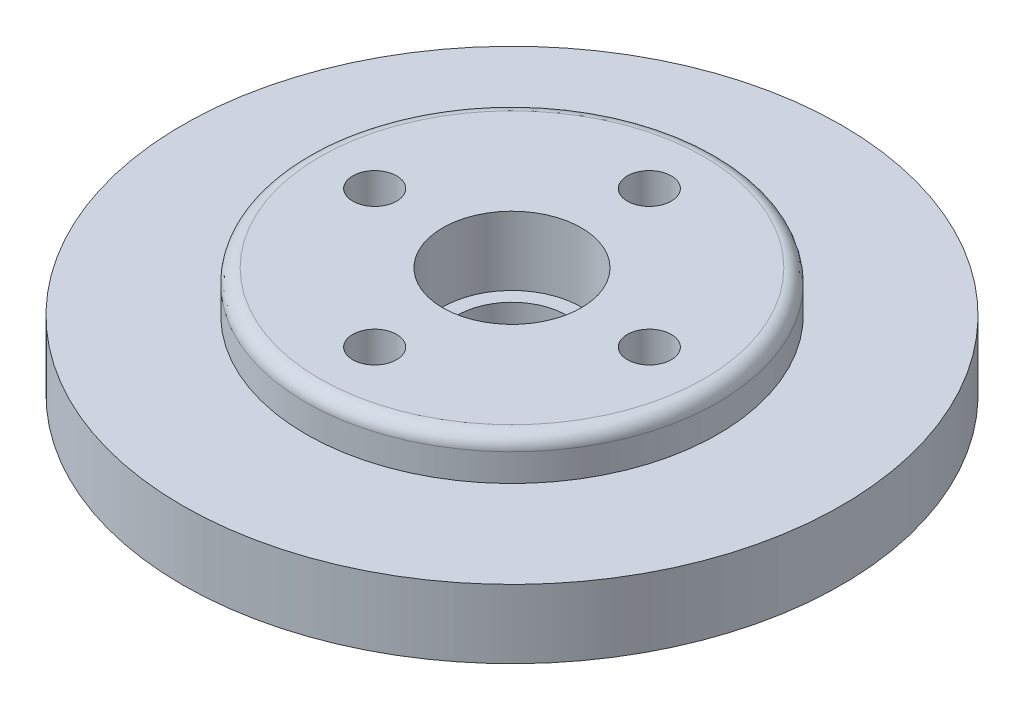
ISO-10303-21;
HEADER;
FILE_DESCRIPTION(('STEP AP214'),'2;1');
FILE_NAME('part.step','',(''),(''),'','','');
FILE_SCHEMA(('AUTOMOTIVE_DESIGN { 1 0 10303 214 1 1 1 1 }'));
ENDSEC;
DATA;
#1=APPLICATION_CONTEXT('core data for automotive mechanical design processes');
#2=APPLICATION_PROTOCOL_DEFINITION('international standard','automotive_design',2000,#1);
#3=PRODUCT_CONTEXT('',#1,'mechanical');
#4=PRODUCT('Part','Part','',(#3));
#5=PRODUCT_RELATED_PRODUCT_CATEGORY('part','',(#4));
#6=PRODUCT_DEFINITION_FORMATION('','',#4);
#7=PRODUCT_DEFINITION_CONTEXT('part definition',#1,'design');
#8=PRODUCT_DEFINITION('design','',#6,#7);
#9=PRODUCT_DEFINITION_SHAPE('','',#8);
#10=(LENGTH_UNIT() NAMED_UNIT(*) SI_UNIT(.MILLI.,.METRE.));
#11=(NAMED_UNIT(*) PLANE_ANGLE_UNIT() SI_UNIT($,.RADIAN.));
#12=(NAMED_UNIT(*) SI_UNIT($,.STERADIAN.) SOLID_ANGLE_UNIT());
#13=UNCERTAINTY_MEASURE_WITH_UNIT(LENGTH_MEASURE(1.E-05),#10,'distance_accuracy_value','');
#14=(GEOMETRIC_REPRESENTATION_CONTEXT(3) GLOBAL_UNCERTAINTY_ASSIGNED_CONTEXT((#13)) GLOBAL_UNIT_ASSIGNED_CONTEXT((#10,
#11,#12)) REPRESENTATION_CONTEXT('',''));
#15=CARTESIAN_POINT('',(0.,0.,0.));
#16=DIRECTION('',(0.,0.,1.));
#17=DIRECTION('',(1.,0.,0.));
#18=AXIS2_PLACEMENT_3D('',#15,#16,#17);
#19=CARTESIAN_POINT('',(-10.,0.,0.));
#20=DIRECTION('',(0.,1.,0.));
#21=DIRECTION('',(0.,0.,1.));
#22=AXIS2_PLACEMENT_3D('',#19,#20,#21);
#23=CYLINDRICAL_SURFACE('',#22,1.6);
#24=CARTESIAN_POINT('',(-10.,8.,0.));
#25=DIRECTION('',(0.,1.,0.));
#26=DIRECTION('',(0.,0.,1.));
#27=AXIS2_PLACEMENT_3D('',#24,#25,#26);
#28=CIRCLE('',#27,1.6);
#29=CARTESIAN_POINT('',(-10.,8.,1.6));
#30=VERTEX_POINT('',#29);
#31=EDGE_CURVE('E407',#30,#30,#28,.T.);
#32=ORIENTED_EDGE('',*,*,#31,.T.);
#33=EDGE_LOOP('',(#32));
#34=FACE_BOUND('',#33,.T.);
#35=CARTESIAN_POINT('',(-10.,3.,0.));
#36=DIRECTION('',(0.,-1.,0.));
#37=DIRECTION('',(0.,0.,-1.));
#38=AXIS2_PLACEMENT_3D('',#35,#36,#37);
#39=CIRCLE('',#38,1.6);
#40=CARTESIAN_POINT('',(-10.,3.,-1.6));
#41=VERTEX_POINT('',#40);
#42=EDGE_CURVE('E40',#41,#41,#39,.F.);
#43=ORIENTED_EDGE('',*,*,#42,.F.);
#44=EDGE_LOOP('',(#43));
#45=FACE_BOUND('',#44,.T.);
#46=ADVANCED_FACE('F36',(#34,#45),#23,.F.);
#47=CARTESIAN_POINT('',(0.,0.,-10.));
#48=DIRECTION('',(0.,1.,0.));
#49=DIRECTION('',(0.,0.,1.));
#50=AXIS2_PLACEMENT_3D('',#47,#48,#49);
#51=CYLINDRICAL_SURFACE('',#50,1.6);
#52=CARTESIAN_POINT('',(0.,8.,-10.));
#53=DIRECTION('',(0.,1.,0.));
#54=DIRECTION('',(0.,0.,1.));
#55=AXIS2_PLACEMENT_3D('',#52,#53,#54);
#56=CIRCLE('',#55,1.6);
#57=CARTESIAN_POINT('',(0.,8.,-8.4));
#58=VERTEX_POINT('',#57);
#59=EDGE_CURVE('E404',#58,#58,#56,.T.);
#60=ORIENTED_EDGE('',*,*,#59,.T.);
#61=EDGE_LOOP('',(#60));
#62=FACE_BOUND('',#61,.T.);
#63=CARTESIAN_POINT('',(0.,3.,-10.));
#64=DIRECTION('',(0.,-1.,0.));
#65=DIRECTION('',(0.,0.,-1.));
#66=AXIS2_PLACEMENT_3D('',#63,#64,#65);
#67=CIRCLE('',#66,1.6);
#68=CARTESIAN_POINT('',(0.,3.,-11.6));
#69=VERTEX_POINT('',#68);
#70=EDGE_CURVE('E436',#69,#69,#67,.F.);
#71=ORIENTED_EDGE('',*,*,#70,.F.);
#72=EDGE_LOOP('',(#71));
#73=FACE_BOUND('',#72,.T.);
#74=ADVANCED_FACE('F446',(#62,#73),#51,.F.);
#75=CARTESIAN_POINT('',(10.,0.,0.));
#76=DIRECTION('',(0.,1.,0.));
#77=DIRECTION('',(0.,0.,1.));
#78=AXIS2_PLACEMENT_3D('',#75,#76,#77);
#79=CYLINDRICAL_SURFACE('',#78,1.6);
#80=CARTESIAN_POINT('',(10.,8.,0.));
#81=DIRECTION('',(0.,1.,0.));
#82=DIRECTION('',(0.,0.,1.));
#83=AXIS2_PLACEMENT_3D('',#80,#81,#82);
#84=CIRCLE('',#83,1.6);
#85=CARTESIAN_POINT('',(10.,8.,1.6));
#86=VERTEX_POINT('',#85);
#87=EDGE_CURVE('E401',#86,#86,#84,.T.);
#88=ORIENTED_EDGE('',*,*,#87,.T.);
#89=EDGE_LOOP('',(#88));
#90=FACE_BOUND('',#89,.T.);
#91=CARTESIAN_POINT('',(10.,3.,0.));
#92=DIRECTION('',(0.,-1.,0.));
#93=DIRECTION('',(0.,0.,-1.));
#94=AXIS2_PLACEMENT_3D('',#91,#92,#93);
#95=CIRCLE('',#94,1.6);
#96=CARTESIAN_POINT('',(10.,3.,-1.6));
#97=VERTEX_POINT('',#96);
#98=EDGE_CURVE('E434',#97,#97,#95,.F.);
#99=ORIENTED_EDGE('',*,*,#98,.F.);
#100=EDGE_LOOP('',(#99));
#101=FACE_BOUND('',#100,.T.);
#102=ADVANCED_FACE('F452',(#90,#101),#79,.F.);
#103=CARTESIAN_POINT('',(0.,0.,10.));
#104=DIRECTION('',(0.,1.,0.));
#105=DIRECTION('',(0.,0.,1.));
#106=AXIS2_PLACEMENT_3D('',#103,#104,#105);
#107=CYLINDRICAL_SURFACE('',#106,1.6);
#108=CARTESIAN_POINT('',(0.,8.,10.));
#109=DIRECTION('',(0.,1.,0.));
#110=DIRECTION('',(0.,0.,1.));
#111=AXIS2_PLACEMENT_3D('',#108,#109,#110);
#112=CIRCLE('',#111,1.6);
#113=CARTESIAN_POINT('',(0.,8.,11.6));
#114=VERTEX_POINT('',#113);
#115=EDGE_CURVE('E397',#114,#114,#112,.T.);
#116=ORIENTED_EDGE('',*,*,#115,.T.);
#117=EDGE_LOOP('',(#116));
#118=FACE_BOUND('',#117,.T.);
#119=CARTESIAN_POINT('',(0.,3.,10.));
#120=DIRECTION('',(0.,-1.,0.));
#121=DIRECTION('',(0.,0.,-1.));
#122=AXIS2_PLACEMENT_3D('',#119,#120,#121);
#123=CIRCLE('',#122,1.6);
#124=CARTESIAN_POINT('',(0.,3.,8.4));
#125=VERTEX_POINT('',#124);
#126=EDGE_CURVE('E248',#125,#125,#123,.F.);
#127=ORIENTED_EDGE('',*,*,#126,.F.);
#128=EDGE_LOOP('',(#127));
#129=FACE_BOUND('',#128,.T.);
#130=ADVANCED_FACE('F813',(#118,#129),#107,.F.);
#131=CARTESIAN_POINT('',(0.,7.,0.));
#132=DIRECTION('',(0.,1.,0.));
#133=DIRECTION('',(0.,0.,1.));
#134=AXIS2_PLACEMENT_3D('',#131,#132,#133);
#135=TOROIDAL_SURFACE('',#134,14.,1.);
#136=CARTESIAN_POINT('',(0.,8.,0.));
#137=DIRECTION('',(0.,1.,0.));
#138=DIRECTION('',(0.,0.,1.));
#139=AXIS2_PLACEMENT_3D('',#136,#137,#138);
#140=CIRCLE('',#139,14.);
#141=CARTESIAN_POINT('',(0.,8.,14.));
#142=VERTEX_POINT('',#141);
#143=EDGE_CURVE('E45',#142,#142,#140,.T.);
#144=ORIENTED_EDGE('',*,*,#143,.F.);
#145=EDGE_LOOP('',(#144));
#146=FACE_BOUND('',#145,.T.);
#147=CARTESIAN_POINT('',(0.,7.,0.));
#148=DIRECTION('',(0.,1.,0.));
#149=DIRECTION('',(0.,0.,1.));
#150=AXIS2_PLACEMENT_3D('',#147,#148,#149);
#151=CIRCLE('',#150,15.);
#152=CARTESIAN_POINT('',(0.,7.,15.));
#153=VERTEX_POINT('',#152);
#154=EDGE_CURVE('E11',#153,#153,#151,.F.);
#155=ORIENTED_EDGE('',*,*,#154,.F.);
#156=EDGE_LOOP('',(#155));
#157=FACE_BOUND('',#156,.T.);
#158=ADVANCED_FACE('F38',(#146,#157),#135,.T.);
#159=CARTESIAN_POINT('',(0.,5.,0.));
#160=DIRECTION('',(0.,-1.,0.));
#161=DIRECTION('',(0.,0.,-1.));
#162=AXIS2_PLACEMENT_3D('',#159,#160,#161);
#163=CYLINDRICAL_SURFACE('',#162,4.);
#164=CARTESIAN_POINT('',(0.,0.,0.));
#165=DIRECTION('',(0.,1.,0.));
#166=DIRECTION('',(0.,0.,1.));
#167=AXIS2_PLACEMENT_3D('',#164,#165,#166);
#168=CIRCLE('',#167,4.);
#169=CARTESIAN_POINT('',(0.,0.,4.));
#170=VERTEX_POINT('',#169);
#171=EDGE_CURVE('E419',#170,#170,#168,.T.);
#172=ORIENTED_EDGE('',*,*,#171,.F.);
#173=EDGE_LOOP('',(#172));
#174=FACE_BOUND('',#173,.T.);
#175=CARTESIAN_POINT('',(0.,3.,0.));
#176=DIRECTION('',(0.,1.,0.));
#177=DIRECTION('',(0.,0.,1.));
#178=AXIS2_PLACEMENT_3D('',#175,#176,#177);
#179=CIRCLE('',#178,4.);
#180=CARTESIAN_POINT('',(0.,3.,4.));
#181=VERTEX_POINT('',#180);
#182=EDGE_CURVE('E413',#181,#181,#179,.T.);
#183=ORIENTED_EDGE('',*,*,#182,.T.);
#184=EDGE_LOOP('',(#183));
#185=FACE_BOUND('',#184,.T.);
#186=ADVANCED_FACE('F474',(#174,#185),#163,.F.);
#187=CARTESIAN_POINT('',(0.,5.,0.));
#188=DIRECTION('',(0.,1.,0.));
#189=DIRECTION('',(0.,0.,1.));
#190=AXIS2_PLACEMENT_3D('',#187,#188,#189);
#191=PLANE('',#190);
#192=CARTESIAN_POINT('',(0.,5.,0.));
#193=DIRECTION('',(0.,1.,0.));
#194=DIRECTION('',(0.,0.,1.));
#195=AXIS2_PLACEMENT_3D('',#192,#193,#194);
#196=CIRCLE('',#195,15.);
#197=CARTESIAN_POINT('',(0.,5.,15.));
#198=VERTEX_POINT('',#197);
#199=EDGE_CURVE('E416',#198,#198,#196,.T.);
#200=ORIENTED_EDGE('',*,*,#199,.F.);
#201=EDGE_LOOP('',(#200));
#202=FACE_BOUND('',#201,.T.);
#203=CARTESIAN_POINT('',(0.,5.,0.));
#204=DIRECTION('',(0.,1.,0.));
#205=DIRECTION('',(0.,0.,1.));
#206=AXIS2_PLACEMENT_3D('',#203,#204,#205);
#207=CIRCLE('',#206,24.);
#208=CARTESIAN_POINT('',(0.,5.,24.));
#209=VERTEX_POINT('',#208);
#210=EDGE_CURVE('E423',#209,#209,#207,.T.);
#211=ORIENTED_EDGE('',*,*,#210,.T.);
#212=EDGE_LOOP('',(#211));
#213=FACE_BOUND('',#212,.T.);
#214=ADVANCED_FACE('F477',(#202,#213),#191,.T.);
#215=CARTESIAN_POINT('',(0.,0.,0.));
#216=DIRECTION('',(0.,1.,0.));
#217=DIRECTION('',(0.,0.,1.));
#218=AXIS2_PLACEMENT_3D('',#215,#216,#217);
#219=PLANE('',#218);
#220=DIRECTION('',(-0.5,0.,0.866025403784438));
#221=VECTOR('',#220,1.);
#222=CARTESIAN_POINT('',(3.1,0.,10.));
#223=LINE('',#222,#221);
#224=CARTESIAN_POINT('',(3.1,0.,10.));
#225=VERTEX_POINT('',#224);
#226=CARTESIAN_POINT('',(1.55,0.,12.6846787517318));
#227=VERTEX_POINT('',#226);
#228=EDGE_CURVE('E235',#225,#227,#223,.T.);
#229=ORIENTED_EDGE('',*,*,#228,.F.);
#230=DIRECTION('',(0.5,0.,0.866025403784439));
#231=VECTOR('',#230,1.);
#232=CARTESIAN_POINT('',(1.55,0.,7.31532124826824));
#233=LINE('',#232,#231);
#234=CARTESIAN_POINT('',(1.55,0.,7.31532124826824));
#235=VERTEX_POINT('',#234);
#236=EDGE_CURVE('E53',#235,#225,#233,.T.);
#237=ORIENTED_EDGE('',*,*,#236,.F.);
#238=DIRECTION('',(1.,0.,0.));
#239=VECTOR('',#238,1.);
#240=CARTESIAN_POINT('',(-1.55,0.,7.31532124826824));
#241=LINE('',#240,#239);
#242=CARTESIAN_POINT('',(-1.55,0.,7.31532124826824));
#243=VERTEX_POINT('',#242);
#244=EDGE_CURVE('E221',#243,#235,#241,.T.);
#245=ORIENTED_EDGE('',*,*,#244,.F.);
#246=DIRECTION('',(0.5,0.,-0.866025403784439));
#247=VECTOR('',#246,1.);
#248=CARTESIAN_POINT('',(-3.1,0.,10.));
#249=LINE('',#248,#247);
#250=CARTESIAN_POINT('',(-3.1,0.,10.));
#251=VERTEX_POINT('',#250);
#252=EDGE_CURVE('E224',#251,#243,#249,.T.);
#253=ORIENTED_EDGE('',*,*,#252,.F.);
#254=DIRECTION('',(-0.5,0.,-0.866025403784438));
#255=VECTOR('',#254,1.);
#256=CARTESIAN_POINT('',(-1.55,0.,12.6846787517318));
#257=LINE('',#256,#255);
#258=CARTESIAN_POINT('',(-1.55,0.,12.6846787517318));
#259=VERTEX_POINT('',#258);
#260=EDGE_CURVE('E241',#259,#251,#257,.T.);
#261=ORIENTED_EDGE('',*,*,#260,.F.);
#262=DIRECTION('',(-1.,0.,0.));
#263=VECTOR('',#262,1.);
#264=CARTESIAN_POINT('',(1.55,0.,12.6846787517318));
#265=LINE('',#264,#263);
#266=EDGE_CURVE('E238',#227,#259,#265,.T.);
#267=ORIENTED_EDGE('',*,*,#266,.F.);
#268=EDGE_LOOP('',(#229,#237,#245,#253,#261,#267));
#269=FACE_BOUND('',#268,.T.);
#270=DIRECTION('',(0.866025403784438,0.,0.5));
#271=VECTOR('',#270,1.);
#272=CARTESIAN_POINT('',(10.0000000000002,0.,-3.09999999999975));
#273=LINE('',#272,#271);
#274=CARTESIAN_POINT('',(10.0000000000002,0.,-3.09999999999975));
#275=VERTEX_POINT('',#274);
#276=CARTESIAN_POINT('',(12.6846787517319,0.,-1.54999999999975));
#277=VERTEX_POINT('',#276);
#278=EDGE_CURVE('E277',#275,#277,#273,.T.);
#279=ORIENTED_EDGE('',*,*,#278,.F.);
#280=DIRECTION('',(0.866025403784439,0.,-0.5));
#281=VECTOR('',#280,1.);
#282=CARTESIAN_POINT('',(7.3153212482684,0.,-1.54999999999975));
#283=LINE('',#282,#281);
#284=CARTESIAN_POINT('',(7.3153212482684,0.,-1.54999999999975));
#285=VERTEX_POINT('',#284);
#286=EDGE_CURVE('E61',#285,#275,#283,.T.);
#287=ORIENTED_EDGE('',*,*,#286,.F.);
#288=DIRECTION('',(0.,0.,-1.));
#289=VECTOR('',#288,1.);
#290=CARTESIAN_POINT('',(7.3153212482684,0.,1.55000000000025));
#291=LINE('',#290,#289);
#292=CARTESIAN_POINT('',(7.3153212482684,0.,1.55000000000025));
#293=VERTEX_POINT('',#292);
#294=EDGE_CURVE('E260',#293,#285,#291,.T.);
#295=ORIENTED_EDGE('',*,*,#294,.F.);
#296=DIRECTION('',(-0.866025403784439,0.,-0.5));
#297=VECTOR('',#296,1.);
#298=CARTESIAN_POINT('',(10.0000000000002,0.,3.10000000000025));
#299=LINE('',#298,#297);
#300=CARTESIAN_POINT('',(10.0000000000002,0.,3.10000000000025));
#301=VERTEX_POINT('',#300);
#302=EDGE_CURVE('E287',#301,#293,#299,.T.);
#303=ORIENTED_EDGE('',*,*,#302,.F.);
#304=DIRECTION('',(-0.866025403784439,0.,0.5));
#305=VECTOR('',#304,1.);
#306=CARTESIAN_POINT('',(12.6846787517319,0.,1.55000000000025));
#307=LINE('',#306,#305);
#308=CARTESIAN_POINT('',(12.6846787517319,0.,1.55000000000025));
#309=VERTEX_POINT('',#308);
#310=EDGE_CURVE('E284',#309,#301,#307,.T.);
#311=ORIENTED_EDGE('',*,*,#310,.F.);
#312=DIRECTION('',(0.,0.,1.));
#313=VECTOR('',#312,1.);
#314=CARTESIAN_POINT('',(12.6846787517319,0.,-1.54999999999975));
#315=LINE('',#314,#313);
#316=EDGE_CURVE('E281',#277,#309,#315,.T.);
#317=ORIENTED_EDGE('',*,*,#316,.F.);
#318=EDGE_LOOP('',(#279,#287,#295,#303,#311,#317));
#319=FACE_BOUND('',#318,.T.);
#320=DIRECTION('',(0.5,0.,-0.866025403784438));
#321=VECTOR('',#320,1.);
#322=CARTESIAN_POINT('',(-3.09999999999959,0.,-9.99999999999992));
#323=LINE('',#322,#321);
#324=CARTESIAN_POINT('',(-3.09999999999959,0.,-9.99999999999992));
#325=VERTEX_POINT('',#324);
#326=CARTESIAN_POINT('',(-1.54999999999959,0.,-12.6846787517317));
#327=VERTEX_POINT('',#326);
#328=EDGE_CURVE('E324',#325,#327,#323,.T.);
#329=ORIENTED_EDGE('',*,*,#328,.F.);
#330=DIRECTION('',(-0.5,0.,-0.866025403784439));
#331=VECTOR('',#330,1.);
#332=CARTESIAN_POINT('',(-1.54999999999959,0.,-7.31532124826816));
#333=LINE('',#332,#331);
#334=CARTESIAN_POINT('',(-1.54999999999959,0.,-7.31532124826816));
#335=VERTEX_POINT('',#334);
#336=EDGE_CURVE('E322',#335,#325,#333,.T.);
#337=ORIENTED_EDGE('',*,*,#336,.F.);
#338=DIRECTION('',(-1.,0.,0.));
#339=VECTOR('',#338,1.);
#340=CARTESIAN_POINT('',(1.55000000000041,0.,-7.31532124826816));
#341=LINE('',#340,#339);
#342=CARTESIAN_POINT('',(1.55000000000041,0.,-7.31532124826816));
#343=VERTEX_POINT('',#342);
#344=EDGE_CURVE('E306',#343,#335,#341,.T.);
#345=ORIENTED_EDGE('',*,*,#344,.F.);
#346=DIRECTION('',(-0.5,0.,0.866025403784438));
#347=VECTOR('',#346,1.);
#348=CARTESIAN_POINT('',(3.10000000000041,0.,-9.99999999999992));
#349=LINE('',#348,#347);
#350=CARTESIAN_POINT('',(3.10000000000041,0.,-9.99999999999992));
#351=VERTEX_POINT('',#350);
#352=EDGE_CURVE('E334',#351,#343,#349,.T.);
#353=ORIENTED_EDGE('',*,*,#352,.F.);
#354=DIRECTION('',(0.5,0.,0.866025403784439));
#355=VECTOR('',#354,1.);
#356=CARTESIAN_POINT('',(1.55000000000041,0.,-12.6846787517317));
#357=LINE('',#356,#355);
#358=CARTESIAN_POINT('',(1.55000000000041,0.,-12.6846787517317));
#359=VERTEX_POINT('',#358);
#360=EDGE_CURVE('E331',#359,#351,#357,.T.);
#361=ORIENTED_EDGE('',*,*,#360,.F.);
#362=DIRECTION('',(1.,0.,0.));
#363=VECTOR('',#362,1.);
#364=CARTESIAN_POINT('',(-1.54999999999959,0.,-12.6846787517317));
#365=LINE('',#364,#363);
#366=EDGE_CURVE('E328',#327,#359,#365,.T.);
#367=ORIENTED_EDGE('',*,*,#366,.F.);
#368=EDGE_LOOP('',(#329,#337,#345,#353,#361,#367));
#369=FACE_BOUND('',#368,.T.);
#370=DIRECTION('',(-0.866025403784438,0.,-0.5));
#371=VECTOR('',#370,1.);
#372=CARTESIAN_POINT('',(-9.99999999999975,0.,3.09999999999983));
#373=LINE('',#372,#371);
#374=CARTESIAN_POINT('',(-9.99999999999975,0.,3.09999999999983));
#375=VERTEX_POINT('',#374);
#376=CARTESIAN_POINT('',(-12.6846787517315,0.,1.54999999999983));
#377=VERTEX_POINT('',#376);
#378=EDGE_CURVE('E372',#375,#377,#373,.T.);
#379=ORIENTED_EDGE('',*,*,#378,.F.);
#380=DIRECTION('',(-0.866025403784439,0.,0.5));
#381=VECTOR('',#380,1.);
#382=CARTESIAN_POINT('',(-7.31532124826799,0.,1.54999999999983));
#383=LINE('',#382,#381);
#384=CARTESIAN_POINT('',(-7.31532124826799,0.,1.54999999999983));
#385=VERTEX_POINT('',#384);
#386=EDGE_CURVE('E370',#385,#375,#383,.T.);
#387=ORIENTED_EDGE('',*,*,#386,.F.);
#388=DIRECTION('',(0.,0.,1.));
#389=VECTOR('',#388,1.);
#390=CARTESIAN_POINT('',(-7.31532124826799,0.,-1.55000000000017));
#391=LINE('',#390,#389);
#392=CARTESIAN_POINT('',(-7.31532124826799,0.,-1.55000000000017));
#393=VERTEX_POINT('',#392);
#394=EDGE_CURVE('E354',#393,#385,#391,.T.);
#395=ORIENTED_EDGE('',*,*,#394,.F.);
#396=DIRECTION('',(0.866025403784438,0.,0.5));
#397=VECTOR('',#396,1.);
#398=CARTESIAN_POINT('',(-9.99999999999975,0.,-3.10000000000017));
#399=LINE('',#398,#397);
#400=CARTESIAN_POINT('',(-9.99999999999975,0.,-3.10000000000017));
#401=VERTEX_POINT('',#400);
#402=EDGE_CURVE('E381',#401,#393,#399,.T.);
#403=ORIENTED_EDGE('',*,*,#402,.F.);
#404=DIRECTION('',(0.866025403784439,0.,-0.5));
#405=VECTOR('',#404,1.);
#406=CARTESIAN_POINT('',(-12.6846787517315,0.,-1.55000000000017));
#407=LINE('',#406,#405);
#408=CARTESIAN_POINT('',(-12.6846787517315,0.,-1.55000000000017));
#409=VERTEX_POINT('',#408);
#410=EDGE_CURVE('E378',#409,#401,#407,.T.);
#411=ORIENTED_EDGE('',*,*,#410,.F.);
#412=DIRECTION('',(0.,0.,-1.));
#413=VECTOR('',#412,1.);
#414=CARTESIAN_POINT('',(-12.6846787517315,0.,1.54999999999983));
#415=LINE('',#414,#413);
#416=EDGE_CURVE('E375',#377,#409,#415,.T.);
#417=ORIENTED_EDGE('',*,*,#416,.F.);
#418=EDGE_LOOP('',(#379,#387,#395,#403,#411,#417));
#419=FACE_BOUND('',#418,.T.);
#420=CARTESIAN_POINT('',(0.,0.,0.));
#421=DIRECTION('',(0.,1.,0.));
#422=DIRECTION('',(0.,0.,1.));
#423=AXIS2_PLACEMENT_3D('',#420,#421,#422);
#424=CIRCLE('',#423,24.);
#425=CARTESIAN_POINT('',(0.,0.,24.));
#426=VERTEX_POINT('',#425);
#427=EDGE_CURVE('E422',#426,#426,#424,.T.);
#428=ORIENTED_EDGE('',*,*,#427,.F.);
#429=EDGE_LOOP('',(#428));
#430=FACE_BOUND('',#429,.T.);
#431=ORIENTED_EDGE('',*,*,#171,.T.);
#432=EDGE_LOOP('',(#431));
#433=FACE_BOUND('',#432,.T.);
#434=ADVANCED_FACE('F481',(#269,#319,#369,#419,#430,#433),#219,.F.);
#435=CARTESIAN_POINT('',(0.,5.,0.));
#436=DIRECTION('',(0.,-1.,0.));
#437=DIRECTION('',(0.,0.,-1.));
#438=AXIS2_PLACEMENT_3D('',#435,#436,#437);
#439=CYLINDRICAL_SURFACE('',#438,24.);
#440=ORIENTED_EDGE('',*,*,#210,.F.);
#441=EDGE_LOOP('',(#440));
#442=FACE_BOUND('',#441,.T.);
#443=ORIENTED_EDGE('',*,*,#427,.T.);
#444=EDGE_LOOP('',(#443));
#445=FACE_BOUND('',#444,.T.);
#446=ADVANCED_FACE('F472',(#442,#445),#439,.T.);
#447=CARTESIAN_POINT('',(0.,8.,0.));
#448=DIRECTION('',(0.,-1.,0.));
#449=DIRECTION('',(0.,0.,-1.));
#450=AXIS2_PLACEMENT_3D('',#447,#448,#449);
#451=CYLINDRICAL_SURFACE('',#450,15.);
#452=ORIENTED_EDGE('',*,*,#154,.T.);
#453=EDGE_LOOP('',(#452));
#454=FACE_BOUND('',#453,.T.);
#455=ORIENTED_EDGE('',*,*,#199,.T.);
#456=EDGE_LOOP('',(#455));
#457=FACE_BOUND('',#456,.T.);
#458=ADVANCED_FACE('F468',(#454,#457),#451,.T.);
#459=CARTESIAN_POINT('',(0.,8.,0.));
#460=DIRECTION('',(0.,1.,0.));
#461=DIRECTION('',(0.,0.,1.));
#462=AXIS2_PLACEMENT_3D('',#459,#460,#461);
#463=PLANE('',#462);
#464=ORIENTED_EDGE('',*,*,#115,.F.);
#465=EDGE_LOOP('',(#464));
#466=FACE_BOUND('',#465,.T.);
#467=ORIENTED_EDGE('',*,*,#87,.F.);
#468=EDGE_LOOP('',(#467));
#469=FACE_BOUND('',#468,.T.);
#470=ORIENTED_EDGE('',*,*,#59,.F.);
#471=EDGE_LOOP('',(#470));
#472=FACE_BOUND('',#471,.T.);
#473=ORIENTED_EDGE('',*,*,#31,.F.);
#474=EDGE_LOOP('',(#473));
#475=FACE_BOUND('',#474,.T.);
#476=ORIENTED_EDGE('',*,*,#143,.T.);
#477=EDGE_LOOP('',(#476));
#478=FACE_BOUND('',#477,.T.);
#479=CARTESIAN_POINT('',(0.,8.,0.));
#480=DIRECTION('',(0.,1.,0.));
#481=DIRECTION('',(0.,0.,1.));
#482=AXIS2_PLACEMENT_3D('',#479,#480,#481);
#483=CIRCLE('',#482,5.05);
#484=CARTESIAN_POINT('',(0.,8.,5.05));
#485=VERTEX_POINT('',#484);
#486=EDGE_CURVE('E400',#485,#485,#483,.T.);
#487=ORIENTED_EDGE('',*,*,#486,.F.);
#488=EDGE_LOOP('',(#487));
#489=FACE_BOUND('',#488,.T.);
#490=ADVANCED_FACE('F464',(#466,#469,#472,#475,#478,#489),#463,.T.);
#491=CARTESIAN_POINT('',(0.,3.,0.));
#492=DIRECTION('',(0.,1.,0.));
#493=DIRECTION('',(0.,0.,1.));
#494=AXIS2_PLACEMENT_3D('',#491,#492,#493);
#495=CYLINDRICAL_SURFACE('',#494,5.05);
#496=CARTESIAN_POINT('',(0.,3.,0.));
#497=DIRECTION('',(0.,1.,0.));
#498=DIRECTION('',(0.,0.,1.));
#499=AXIS2_PLACEMENT_3D('',#496,#497,#498);
#500=CIRCLE('',#499,5.05);
#501=CARTESIAN_POINT('',(0.,3.,5.05));
#502=VERTEX_POINT('',#501);
#503=EDGE_CURVE('E410',#502,#502,#500,.T.);
#504=ORIENTED_EDGE('',*,*,#503,.F.);
#505=EDGE_LOOP('',(#504));
#506=FACE_BOUND('',#505,.T.);
#507=ORIENTED_EDGE('',*,*,#486,.T.);
#508=EDGE_LOOP('',(#507));
#509=FACE_BOUND('',#508,.T.);
#510=ADVANCED_FACE('F460',(#506,#509),#495,.F.);
#511=CARTESIAN_POINT('',(0.,3.,0.));
#512=DIRECTION('',(0.,1.,0.));
#513=DIRECTION('',(0.,0.,1.));
#514=AXIS2_PLACEMENT_3D('',#511,#512,#513);
#515=PLANE('',#514);
#516=ORIENTED_EDGE('',*,*,#182,.F.);
#517=EDGE_LOOP('',(#516));
#518=FACE_BOUND('',#517,.T.);
#519=ORIENTED_EDGE('',*,*,#503,.T.);
#520=EDGE_LOOP('',(#519));
#521=FACE_BOUND('',#520,.T.);
#522=ADVANCED_FACE('F457',(#518,#521),#515,.T.);
#523=CARTESIAN_POINT('',(0.,3.,0.));
#524=DIRECTION('',(0.,-1.,0.));
#525=DIRECTION('',(0.,0.,-1.));
#526=AXIS2_PLACEMENT_3D('',#523,#524,#525);
#527=PLANE('',#526);
#528=DIRECTION('',(0.5,0.,0.866025403784439));
#529=VECTOR('',#528,1.);
#530=CARTESIAN_POINT('',(1.55,3.,7.31532124826824));
#531=LINE('',#530,#529);
#532=CARTESIAN_POINT('',(1.55,3.,7.31532124826824));
#533=VERTEX_POINT('',#532);
#534=CARTESIAN_POINT('',(3.1,3.,10.));
#535=VERTEX_POINT('',#534);
#536=EDGE_CURVE('E201',#533,#535,#531,.T.);
#537=ORIENTED_EDGE('',*,*,#536,.T.);
#538=DIRECTION('',(-0.5,0.,0.866025403784438));
#539=VECTOR('',#538,1.);
#540=CARTESIAN_POINT('',(3.1,3.,10.));
#541=LINE('',#540,#539);
#542=CARTESIAN_POINT('',(1.55,3.,12.6846787517318));
#543=VERTEX_POINT('',#542);
#544=EDGE_CURVE('E210',#535,#543,#541,.T.);
#545=ORIENTED_EDGE('',*,*,#544,.T.);
#546=DIRECTION('',(-1.,0.,0.));
#547=VECTOR('',#546,1.);
#548=CARTESIAN_POINT('',(1.55,3.,12.6846787517318));
#549=LINE('',#548,#547);
#550=CARTESIAN_POINT('',(-1.55,3.,12.6846787517318));
#551=VERTEX_POINT('',#550);
#552=EDGE_CURVE('E215',#543,#551,#549,.T.);
#553=ORIENTED_EDGE('',*,*,#552,.T.);
#554=DIRECTION('',(-0.5,0.,-0.866025403784438));
#555=VECTOR('',#554,1.);
#556=CARTESIAN_POINT('',(-1.55,3.,12.6846787517318));
#557=LINE('',#556,#555);
#558=CARTESIAN_POINT('',(-3.1,3.,10.));
#559=VERTEX_POINT('',#558);
#560=EDGE_CURVE('E228',#551,#559,#557,.T.);
#561=ORIENTED_EDGE('',*,*,#560,.T.);
#562=DIRECTION('',(0.5,0.,-0.866025403784439));
#563=VECTOR('',#562,1.);
#564=CARTESIAN_POINT('',(-3.1,3.,10.));
#565=LINE('',#564,#563);
#566=CARTESIAN_POINT('',(-1.55,3.,7.31532124826824));
#567=VERTEX_POINT('',#566);
#568=EDGE_CURVE('E231',#559,#567,#565,.T.);
#569=ORIENTED_EDGE('',*,*,#568,.T.);
#570=DIRECTION('',(1.,0.,0.));
#571=VECTOR('',#570,1.);
#572=CARTESIAN_POINT('',(-1.55,3.,7.31532124826824));
#573=LINE('',#572,#571);
#574=EDGE_CURVE('E207',#567,#533,#573,.T.);
#575=ORIENTED_EDGE('',*,*,#574,.T.);
#576=EDGE_LOOP('',(#537,#545,#553,#561,#569,#575));
#577=FACE_BOUND('',#576,.T.);
#578=ORIENTED_EDGE('',*,*,#126,.T.);
#579=EDGE_LOOP('',(#578));
#580=FACE_BOUND('',#579,.T.);
#581=ADVANCED_FACE('F217',(#577,#580),#527,.T.);
#582=CARTESIAN_POINT('',(1.55,3.,7.31532124826824));
#583=DIRECTION('',(0.866025403784439,0.,-0.5));
#584=DIRECTION('',(-0.5,0.,-0.866025403784439));
#585=AXIS2_PLACEMENT_3D('',#582,#583,#584);
#586=PLANE('',#585);
#587=ORIENTED_EDGE('',*,*,#236,.T.);
#588=DIRECTION('',(0.,-1.,0.));
#589=VECTOR('',#588,1.);
#590=CARTESIAN_POINT('',(3.1,3.,10.));
#591=LINE('',#590,#589);
#592=EDGE_CURVE('E197',#535,#225,#591,.T.);
#593=ORIENTED_EDGE('',*,*,#592,.F.);
#594=ORIENTED_EDGE('',*,*,#536,.F.);
#595=DIRECTION('',(0.,-1.,0.));
#596=VECTOR('',#595,1.);
#597=CARTESIAN_POINT('',(1.55,3.,7.31532124826824));
#598=LINE('',#597,#596);
#599=EDGE_CURVE('E246',#533,#235,#598,.T.);
#600=ORIENTED_EDGE('',*,*,#599,.T.);
#601=EDGE_LOOP('',(#587,#593,#594,#600));
#602=FACE_BOUND('',#601,.T.);
#603=ADVANCED_FACE('F199',(#602),#586,.F.);
#604=CARTESIAN_POINT('',(-1.55,3.,7.31532124826824));
#605=DIRECTION('',(0.,0.,-1.));
#606=DIRECTION('',(-1.,0.,0.));
#607=AXIS2_PLACEMENT_3D('',#604,#605,#606);
#608=PLANE('',#607);
#609=ORIENTED_EDGE('',*,*,#244,.T.);
#610=ORIENTED_EDGE('',*,*,#599,.F.);
#611=ORIENTED_EDGE('',*,*,#574,.F.);
#612=DIRECTION('',(0.,-1.,0.));
#613=VECTOR('',#612,1.);
#614=CARTESIAN_POINT('',(-1.55,3.,7.31532124826824));
#615=LINE('',#614,#613);
#616=EDGE_CURVE('E249',#567,#243,#615,.T.);
#617=ORIENTED_EDGE('',*,*,#616,.T.);
#618=EDGE_LOOP('',(#609,#610,#611,#617));
#619=FACE_BOUND('',#618,.T.);
#620=ADVANCED_FACE('F536',(#619),#608,.F.);
#621=CARTESIAN_POINT('',(-3.1,3.,10.));
#622=DIRECTION('',(-0.866025403784439,0.,-0.5));
#623=DIRECTION('',(-0.5,0.,0.866025403784439));
#624=AXIS2_PLACEMENT_3D('',#621,#622,#623);
#625=PLANE('',#624);
#626=ORIENTED_EDGE('',*,*,#252,.T.);
#627=ORIENTED_EDGE('',*,*,#616,.F.);
#628=ORIENTED_EDGE('',*,*,#568,.F.);
#629=DIRECTION('',(0.,-1.,0.));
#630=VECTOR('',#629,1.);
#631=CARTESIAN_POINT('',(-3.1,3.,10.));
#632=LINE('',#631,#630);
#633=EDGE_CURVE('E251',#559,#251,#632,.T.);
#634=ORIENTED_EDGE('',*,*,#633,.T.);
#635=EDGE_LOOP('',(#626,#627,#628,#634));
#636=FACE_BOUND('',#635,.T.);
#637=ADVANCED_FACE('F543',(#636),#625,.F.);
#638=CARTESIAN_POINT('',(-1.55,3.,12.6846787517318));
#639=DIRECTION('',(-0.866025403784439,0.,0.5));
#640=DIRECTION('',(0.5,0.,0.866025403784439));
#641=AXIS2_PLACEMENT_3D('',#638,#639,#640);
#642=PLANE('',#641);
#643=ORIENTED_EDGE('',*,*,#260,.T.);
#644=ORIENTED_EDGE('',*,*,#633,.F.);
#645=ORIENTED_EDGE('',*,*,#560,.F.);
#646=DIRECTION('',(0.,-1.,0.));
#647=VECTOR('',#646,1.);
#648=CARTESIAN_POINT('',(-1.55,3.,12.6846787517318));
#649=LINE('',#648,#647);
#650=EDGE_CURVE('E253',#551,#259,#649,.T.);
#651=ORIENTED_EDGE('',*,*,#650,.T.);
#652=EDGE_LOOP('',(#643,#644,#645,#651));
#653=FACE_BOUND('',#652,.T.);
#654=ADVANCED_FACE('F551',(#653),#642,.F.);
#655=CARTESIAN_POINT('',(1.55,3.,12.6846787517318));
#656=DIRECTION('',(0.,0.,1.));
#657=DIRECTION('',(1.,0.,0.));
#658=AXIS2_PLACEMENT_3D('',#655,#656,#657);
#659=PLANE('',#658);
#660=ORIENTED_EDGE('',*,*,#266,.T.);
#661=ORIENTED_EDGE('',*,*,#650,.F.);
#662=ORIENTED_EDGE('',*,*,#552,.F.);
#663=DIRECTION('',(0.,-1.,0.));
#664=VECTOR('',#663,1.);
#665=CARTESIAN_POINT('',(1.55,3.,12.6846787517318));
#666=LINE('',#665,#664);
#667=EDGE_CURVE('E206',#543,#227,#666,.T.);
#668=ORIENTED_EDGE('',*,*,#667,.T.);
#669=EDGE_LOOP('',(#660,#661,#662,#668));
#670=FACE_BOUND('',#669,.T.);
#671=ADVANCED_FACE('F559',(#670),#659,.F.);
#672=CARTESIAN_POINT('',(3.1,3.,10.));
#673=DIRECTION('',(0.866025403784439,0.,0.5));
#674=DIRECTION('',(0.5,0.,-0.866025403784439));
#675=AXIS2_PLACEMENT_3D('',#672,#673,#674);
#676=PLANE('',#675);
#677=ORIENTED_EDGE('',*,*,#228,.T.);
#678=ORIENTED_EDGE('',*,*,#667,.F.);
#679=ORIENTED_EDGE('',*,*,#544,.F.);
#680=ORIENTED_EDGE('',*,*,#592,.T.);
#681=EDGE_LOOP('',(#677,#678,#679,#680));
#682=FACE_BOUND('',#681,.T.);
#683=ADVANCED_FACE('F211',(#682),#676,.F.);
#684=CARTESIAN_POINT('',(0.,3.,0.));
#685=DIRECTION('',(0.,-1.,0.));
#686=DIRECTION('',(0.,0.,-1.));
#687=AXIS2_PLACEMENT_3D('',#684,#685,#686);
#688=PLANE('',#687);
#689=DIRECTION('',(0.866025403784439,0.,-0.5));
#690=VECTOR('',#689,1.);
#691=CARTESIAN_POINT('',(7.3153212482684,3.,-1.54999999999975));
#692=LINE('',#691,#690);
#693=CARTESIAN_POINT('',(7.3153212482684,3.,-1.54999999999975));
#694=VERTEX_POINT('',#693);
#695=CARTESIAN_POINT('',(10.0000000000002,3.,-3.09999999999975));
#696=VERTEX_POINT('',#695);
#697=EDGE_CURVE('E256',#694,#696,#692,.T.);
#698=ORIENTED_EDGE('',*,*,#697,.T.);
#699=DIRECTION('',(0.866025403784438,0.,0.5));
#700=VECTOR('',#699,1.);
#701=CARTESIAN_POINT('',(10.0000000000002,3.,-3.09999999999975));
#702=LINE('',#701,#700);
#703=CARTESIAN_POINT('',(12.6846787517319,3.,-1.54999999999975));
#704=VERTEX_POINT('',#703);
#705=EDGE_CURVE('E259',#696,#704,#702,.T.);
#706=ORIENTED_EDGE('',*,*,#705,.T.);
#707=DIRECTION('',(0.,0.,1.));
#708=VECTOR('',#707,1.);
#709=CARTESIAN_POINT('',(12.6846787517319,3.,-1.54999999999975));
#710=LINE('',#709,#708);
#711=CARTESIAN_POINT('',(12.6846787517319,3.,1.55000000000025));
#712=VERTEX_POINT('',#711);
#713=EDGE_CURVE('E263',#704,#712,#710,.T.);
#714=ORIENTED_EDGE('',*,*,#713,.T.);
#715=DIRECTION('',(-0.866025403784439,0.,0.5));
#716=VECTOR('',#715,1.);
#717=CARTESIAN_POINT('',(12.6846787517319,3.,1.55000000000025));
#718=LINE('',#717,#716);
#719=CARTESIAN_POINT('',(10.0000000000002,3.,3.10000000000025));
#720=VERTEX_POINT('',#719);
#721=EDGE_CURVE('E266',#712,#720,#718,.T.);
#722=ORIENTED_EDGE('',*,*,#721,.T.);
#723=DIRECTION('',(-0.866025403784439,0.,-0.5));
#724=VECTOR('',#723,1.);
#725=CARTESIAN_POINT('',(10.0000000000002,3.,3.10000000000025));
#726=LINE('',#725,#724);
#727=CARTESIAN_POINT('',(7.3153212482684,3.,1.55000000000025));
#728=VERTEX_POINT('',#727);
#729=EDGE_CURVE('E269',#720,#728,#726,.T.);
#730=ORIENTED_EDGE('',*,*,#729,.T.);
#731=DIRECTION('',(0.,0.,-1.));
#732=VECTOR('',#731,1.);
#733=CARTESIAN_POINT('',(7.3153212482684,3.,1.55000000000025));
#734=LINE('',#733,#732);
#735=EDGE_CURVE('E272',#728,#694,#734,.T.);
#736=ORIENTED_EDGE('',*,*,#735,.T.);
#737=EDGE_LOOP('',(#698,#706,#714,#722,#730,#736));
#738=FACE_BOUND('',#737,.T.);
#739=ORIENTED_EDGE('',*,*,#98,.T.);
#740=EDGE_LOOP('',(#739));
#741=FACE_BOUND('',#740,.T.);
#742=ADVANCED_FACE('F574',(#738,#741),#688,.T.);
#743=CARTESIAN_POINT('',(7.3153212482684,3.,-1.54999999999975));
#744=DIRECTION('',(-0.5,0.,-0.866025403784439));
#745=DIRECTION('',(-0.866025403784439,0.,0.5));
#746=AXIS2_PLACEMENT_3D('',#743,#744,#745);
#747=PLANE('',#746);
#748=ORIENTED_EDGE('',*,*,#286,.T.);
#749=DIRECTION('',(0.,-1.,0.));
#750=VECTOR('',#749,1.);
#751=CARTESIAN_POINT('',(10.0000000000002,3.,-3.09999999999975));
#752=LINE('',#751,#750);
#753=EDGE_CURVE('E275',#696,#275,#752,.T.);
#754=ORIENTED_EDGE('',*,*,#753,.F.);
#755=ORIENTED_EDGE('',*,*,#697,.F.);
#756=DIRECTION('',(0.,-1.,0.));
#757=VECTOR('',#756,1.);
#758=CARTESIAN_POINT('',(7.3153212482684,3.,-1.54999999999975));
#759=LINE('',#758,#757);
#760=EDGE_CURVE('E236',#694,#285,#759,.T.);
#761=ORIENTED_EDGE('',*,*,#760,.T.);
#762=EDGE_LOOP('',(#748,#754,#755,#761));
#763=FACE_BOUND('',#762,.T.);
#764=ADVANCED_FACE('F581',(#763),#747,.F.);
#765=CARTESIAN_POINT('',(7.3153212482684,3.,1.55000000000025));
#766=DIRECTION('',(-1.,0.,0.));
#767=DIRECTION('',(0.,0.,1.));
#768=AXIS2_PLACEMENT_3D('',#765,#766,#767);
#769=PLANE('',#768);
#770=ORIENTED_EDGE('',*,*,#294,.T.);
#771=ORIENTED_EDGE('',*,*,#760,.F.);
#772=ORIENTED_EDGE('',*,*,#735,.F.);
#773=DIRECTION('',(0.,-1.,0.));
#774=VECTOR('',#773,1.);
#775=CARTESIAN_POINT('',(7.3153212482684,3.,1.55000000000025));
#776=LINE('',#775,#774);
#777=EDGE_CURVE('E293',#728,#293,#776,.T.);
#778=ORIENTED_EDGE('',*,*,#777,.T.);
#779=EDGE_LOOP('',(#770,#771,#772,#778));
#780=FACE_BOUND('',#779,.T.);
#781=ADVANCED_FACE('F589',(#780),#769,.F.);
#782=CARTESIAN_POINT('',(10.0000000000002,3.,3.10000000000025));
#783=DIRECTION('',(-0.5,0.,0.866025403784438));
#784=DIRECTION('',(0.866025403784439,0.,0.5));
#785=AXIS2_PLACEMENT_3D('',#782,#783,#784);
#786=PLANE('',#785);
#787=ORIENTED_EDGE('',*,*,#302,.T.);
#788=ORIENTED_EDGE('',*,*,#777,.F.);
#789=ORIENTED_EDGE('',*,*,#729,.F.);
#790=DIRECTION('',(0.,-1.,0.));
#791=VECTOR('',#790,1.);
#792=CARTESIAN_POINT('',(10.0000000000002,3.,3.10000000000025));
#793=LINE('',#792,#791);
#794=EDGE_CURVE('E295',#720,#301,#793,.T.);
#795=ORIENTED_EDGE('',*,*,#794,.T.);
#796=EDGE_LOOP('',(#787,#788,#789,#795));
#797=FACE_BOUND('',#796,.T.);
#798=ADVANCED_FACE('F596',(#797),#786,.F.);
#799=CARTESIAN_POINT('',(12.6846787517319,3.,1.55000000000025));
#800=DIRECTION('',(0.5,0.,0.866025403784439));
#801=DIRECTION('',(0.866025403784439,0.,-0.5));
#802=AXIS2_PLACEMENT_3D('',#799,#800,#801);
#803=PLANE('',#802);
#804=ORIENTED_EDGE('',*,*,#310,.T.);
#805=ORIENTED_EDGE('',*,*,#794,.F.);
#806=ORIENTED_EDGE('',*,*,#721,.F.);
#807=DIRECTION('',(0.,-1.,0.));
#808=VECTOR('',#807,1.);
#809=CARTESIAN_POINT('',(12.6846787517319,3.,1.55000000000025));
#810=LINE('',#809,#808);
#811=EDGE_CURVE('E297',#712,#309,#810,.T.);
#812=ORIENTED_EDGE('',*,*,#811,.T.);
#813=EDGE_LOOP('',(#804,#805,#806,#812));
#814=FACE_BOUND('',#813,.T.);
#815=ADVANCED_FACE('F604',(#814),#803,.F.);
#816=CARTESIAN_POINT('',(12.6846787517319,3.,-1.54999999999975));
#817=DIRECTION('',(1.,0.,0.));
#818=DIRECTION('',(0.,0.,-1.));
#819=AXIS2_PLACEMENT_3D('',#816,#817,#818);
#820=PLANE('',#819);
#821=ORIENTED_EDGE('',*,*,#316,.T.);
#822=ORIENTED_EDGE('',*,*,#811,.F.);
#823=ORIENTED_EDGE('',*,*,#713,.F.);
#824=DIRECTION('',(0.,-1.,0.));
#825=VECTOR('',#824,1.);
#826=CARTESIAN_POINT('',(12.6846787517319,3.,-1.54999999999975));
#827=LINE('',#826,#825);
#828=EDGE_CURVE('E299',#704,#277,#827,.T.);
#829=ORIENTED_EDGE('',*,*,#828,.T.);
#830=EDGE_LOOP('',(#821,#822,#823,#829));
#831=FACE_BOUND('',#830,.T.);
#832=ADVANCED_FACE('F612',(#831),#820,.F.);
#833=CARTESIAN_POINT('',(10.0000000000002,3.,-3.09999999999975));
#834=DIRECTION('',(0.5,0.,-0.866025403784438));
#835=DIRECTION('',(-0.866025403784439,0.,-0.5));
#836=AXIS2_PLACEMENT_3D('',#833,#834,#835);
#837=PLANE('',#836);
#838=ORIENTED_EDGE('',*,*,#278,.T.);
#839=ORIENTED_EDGE('',*,*,#828,.F.);
#840=ORIENTED_EDGE('',*,*,#705,.F.);
#841=ORIENTED_EDGE('',*,*,#753,.T.);
#842=EDGE_LOOP('',(#838,#839,#840,#841));
#843=FACE_BOUND('',#842,.T.);
#844=ADVANCED_FACE('F620',(#843),#837,.F.);
#845=CARTESIAN_POINT('',(0.,3.,0.));
#846=DIRECTION('',(0.,-1.,0.));
#847=DIRECTION('',(0.,0.,-1.));
#848=AXIS2_PLACEMENT_3D('',#845,#846,#847);
#849=PLANE('',#848);
#850=DIRECTION('',(-0.5,0.,-0.866025403784439));
#851=VECTOR('',#850,1.);
#852=CARTESIAN_POINT('',(-1.54999999999959,3.,-7.31532124826816));
#853=LINE('',#852,#851);
#854=CARTESIAN_POINT('',(-1.54999999999959,3.,-7.31532124826816));
#855=VERTEX_POINT('',#854);
#856=CARTESIAN_POINT('',(-3.09999999999959,3.,-9.99999999999992));
#857=VERTEX_POINT('',#856);
#858=EDGE_CURVE('E302',#855,#857,#853,.T.);
#859=ORIENTED_EDGE('',*,*,#858,.T.);
#860=DIRECTION('',(0.5,0.,-0.866025403784438));
#861=VECTOR('',#860,1.);
#862=CARTESIAN_POINT('',(-3.09999999999959,3.,-9.99999999999992));
#863=LINE('',#862,#861);
#864=CARTESIAN_POINT('',(-1.54999999999959,3.,-12.6846787517317));
#865=VERTEX_POINT('',#864);
#866=EDGE_CURVE('E305',#857,#865,#863,.T.);
#867=ORIENTED_EDGE('',*,*,#866,.T.);
#868=DIRECTION('',(1.,0.,0.));
#869=VECTOR('',#868,1.);
#870=CARTESIAN_POINT('',(-1.54999999999959,3.,-12.6846787517317));
#871=LINE('',#870,#869);
#872=CARTESIAN_POINT('',(1.55000000000041,3.,-12.6846787517317));
#873=VERTEX_POINT('',#872);
#874=EDGE_CURVE('E309',#865,#873,#871,.T.);
#875=ORIENTED_EDGE('',*,*,#874,.T.);
#876=DIRECTION('',(0.5,0.,0.866025403784439));
#877=VECTOR('',#876,1.);
#878=CARTESIAN_POINT('',(1.55000000000041,3.,-12.6846787517317));
#879=LINE('',#878,#877);
#880=CARTESIAN_POINT('',(3.10000000000041,3.,-9.99999999999992));
#881=VERTEX_POINT('',#880);
#882=EDGE_CURVE('E312',#873,#881,#879,.T.);
#883=ORIENTED_EDGE('',*,*,#882,.T.);
#884=DIRECTION('',(-0.5,0.,0.866025403784438));
#885=VECTOR('',#884,1.);
#886=CARTESIAN_POINT('',(3.10000000000041,3.,-9.99999999999992));
#887=LINE('',#886,#885);
#888=CARTESIAN_POINT('',(1.55000000000041,3.,-7.31532124826816));
#889=VERTEX_POINT('',#888);
#890=EDGE_CURVE('E315',#881,#889,#887,.T.);
#891=ORIENTED_EDGE('',*,*,#890,.T.);
#892=DIRECTION('',(-1.,0.,0.));
#893=VECTOR('',#892,1.);
#894=CARTESIAN_POINT('',(1.55000000000041,3.,-7.31532124826816));
#895=LINE('',#894,#893);
#896=EDGE_CURVE('E318',#889,#855,#895,.T.);
#897=ORIENTED_EDGE('',*,*,#896,.T.);
#898=EDGE_LOOP('',(#859,#867,#875,#883,#891,#897));
#899=FACE_BOUND('',#898,.T.);
#900=ORIENTED_EDGE('',*,*,#70,.T.);
#901=EDGE_LOOP('',(#900));
#902=FACE_BOUND('',#901,.T.);
#903=ADVANCED_FACE('F628',(#899,#902),#849,.T.);
#904=CARTESIAN_POINT('',(-1.54999999999959,3.,-7.31532124826816));
#905=DIRECTION('',(-0.866025403784439,0.,0.499999999999999));
#906=DIRECTION('',(0.5,0.,0.866025403784439));
#907=AXIS2_PLACEMENT_3D('',#904,#905,#906);
#908=PLANE('',#907);
#909=ORIENTED_EDGE('',*,*,#336,.T.);
#910=DIRECTION('',(0.,-1.,0.));
#911=VECTOR('',#910,1.);
#912=CARTESIAN_POINT('',(-3.09999999999959,3.,-9.99999999999992));
#913=LINE('',#912,#911);
#914=EDGE_CURVE('E321',#857,#325,#913,.T.);
#915=ORIENTED_EDGE('',*,*,#914,.F.);
#916=ORIENTED_EDGE('',*,*,#858,.F.);
#917=DIRECTION('',(0.,-1.,0.));
#918=VECTOR('',#917,1.);
#919=CARTESIAN_POINT('',(-1.54999999999959,3.,-7.31532124826816));
#920=LINE('',#919,#918);
#921=EDGE_CURVE('E278',#855,#335,#920,.T.);
#922=ORIENTED_EDGE('',*,*,#921,.T.);
#923=EDGE_LOOP('',(#909,#915,#916,#922));
#924=FACE_BOUND('',#923,.T.);
#925=ADVANCED_FACE('F636',(#924),#908,.F.);
#926=CARTESIAN_POINT('',(1.55000000000041,3.,-7.31532124826816));
#927=DIRECTION('',(0.,0.,1.));
#928=DIRECTION('',(1.,0.,0.));
#929=AXIS2_PLACEMENT_3D('',#926,#927,#928);
#930=PLANE('',#929);
#931=ORIENTED_EDGE('',*,*,#344,.T.);
#932=ORIENTED_EDGE('',*,*,#921,.F.);
#933=ORIENTED_EDGE('',*,*,#896,.F.);
#934=DIRECTION('',(0.,-1.,0.));
#935=VECTOR('',#934,1.);
#936=CARTESIAN_POINT('',(1.55000000000041,3.,-7.31532124826816));
#937=LINE('',#936,#935);
#938=EDGE_CURVE('E340',#889,#343,#937,.T.);
#939=ORIENTED_EDGE('',*,*,#938,.T.);
#940=EDGE_LOOP('',(#931,#932,#933,#939));
#941=FACE_BOUND('',#940,.T.);
#942=ADVANCED_FACE('F644',(#941),#930,.F.);
#943=CARTESIAN_POINT('',(3.10000000000041,3.,-9.99999999999992));
#944=DIRECTION('',(0.866025403784439,0.,0.5));
#945=DIRECTION('',(0.5,0.,-0.866025403784439));
#946=AXIS2_PLACEMENT_3D('',#943,#944,#945);
#947=PLANE('',#946);
#948=ORIENTED_EDGE('',*,*,#352,.T.);
#949=ORIENTED_EDGE('',*,*,#938,.F.);
#950=ORIENTED_EDGE('',*,*,#890,.F.);
#951=DIRECTION('',(0.,-1.,0.));
#952=VECTOR('',#951,1.);
#953=CARTESIAN_POINT('',(3.10000000000041,3.,-9.99999999999992));
#954=LINE('',#953,#952);
#955=EDGE_CURVE('E342',#881,#351,#954,.T.);
#956=ORIENTED_EDGE('',*,*,#955,.T.);
#957=EDGE_LOOP('',(#948,#949,#950,#956));
#958=FACE_BOUND('',#957,.T.);
#959=ADVANCED_FACE('F652',(#958),#947,.F.);
#960=CARTESIAN_POINT('',(1.55000000000041,3.,-12.6846787517317));
#961=DIRECTION('',(0.866025403784439,0.,-0.5));
#962=DIRECTION('',(-0.5,0.,-0.866025403784439));
#963=AXIS2_PLACEMENT_3D('',#960,#961,#962);
#964=PLANE('',#963);
#965=ORIENTED_EDGE('',*,*,#360,.T.);
#966=ORIENTED_EDGE('',*,*,#955,.F.);
#967=ORIENTED_EDGE('',*,*,#882,.F.);
#968=DIRECTION('',(0.,-1.,0.));
#969=VECTOR('',#968,1.);
#970=CARTESIAN_POINT('',(1.55000000000041,3.,-12.6846787517317));
#971=LINE('',#970,#969);
#972=EDGE_CURVE('E344',#873,#359,#971,.T.);
#973=ORIENTED_EDGE('',*,*,#972,.T.);
#974=EDGE_LOOP('',(#965,#966,#967,#973));
#975=FACE_BOUND('',#974,.T.);
#976=ADVANCED_FACE('F660',(#975),#964,.F.);
#977=CARTESIAN_POINT('',(-1.54999999999959,3.,-12.6846787517317));
#978=DIRECTION('',(0.,0.,-1.));
#979=DIRECTION('',(-1.,0.,0.));
#980=AXIS2_PLACEMENT_3D('',#977,#978,#979);
#981=PLANE('',#980);
#982=ORIENTED_EDGE('',*,*,#366,.T.);
#983=ORIENTED_EDGE('',*,*,#972,.F.);
#984=ORIENTED_EDGE('',*,*,#874,.F.);
#985=DIRECTION('',(0.,-1.,0.));
#986=VECTOR('',#985,1.);
#987=CARTESIAN_POINT('',(-1.54999999999959,3.,-12.6846787517317));
#988=LINE('',#987,#986);
#989=EDGE_CURVE('E346',#865,#327,#988,.T.);
#990=ORIENTED_EDGE('',*,*,#989,.T.);
#991=EDGE_LOOP('',(#982,#983,#984,#990));
#992=FACE_BOUND('',#991,.T.);
#993=ADVANCED_FACE('F668',(#992),#981,.F.);
#994=CARTESIAN_POINT('',(-3.09999999999959,3.,-9.99999999999992));
#995=DIRECTION('',(-0.866025403784438,0.,-0.5));
#996=DIRECTION('',(-0.5,0.,0.866025403784439));
#997=AXIS2_PLACEMENT_3D('',#994,#995,#996);
#998=PLANE('',#997);
#999=ORIENTED_EDGE('',*,*,#328,.T.);
#1000=ORIENTED_EDGE('',*,*,#989,.F.);
#1001=ORIENTED_EDGE('',*,*,#866,.F.);
#1002=ORIENTED_EDGE('',*,*,#914,.T.);
#1003=EDGE_LOOP('',(#999,#1000,#1001,#1002));
#1004=FACE_BOUND('',#1003,.T.);
#1005=ADVANCED_FACE('F676',(#1004),#998,.F.);
#1006=CARTESIAN_POINT('',(0.,3.,0.));
#1007=DIRECTION('',(0.,-1.,0.));
#1008=DIRECTION('',(0.,0.,-1.));
#1009=AXIS2_PLACEMENT_3D('',#1006,#1007,#1008);
#1010=PLANE('',#1009);
#1011=DIRECTION('',(-0.866025403784439,0.,0.5));
#1012=VECTOR('',#1011,1.);
#1013=CARTESIAN_POINT('',(-7.31532124826799,3.,1.54999999999983));
#1014=LINE('',#1013,#1012);
#1015=CARTESIAN_POINT('',(-7.31532124826799,3.,1.54999999999983));
#1016=VERTEX_POINT('',#1015);
#1017=CARTESIAN_POINT('',(-9.99999999999975,3.,3.09999999999983));
#1018=VERTEX_POINT('',#1017);
#1019=EDGE_CURVE('E350',#1016,#1018,#1014,.T.);
#1020=ORIENTED_EDGE('',*,*,#1019,.T.);
#1021=DIRECTION('',(-0.866025403784438,0.,-0.5));
#1022=VECTOR('',#1021,1.);
#1023=CARTESIAN_POINT('',(-9.99999999999975,3.,3.09999999999983));
#1024=LINE('',#1023,#1022);
#1025=CARTESIAN_POINT('',(-12.6846787517315,3.,1.54999999999983));
#1026=VERTEX_POINT('',#1025);
#1027=EDGE_CURVE('E353',#1018,#1026,#1024,.T.);
#1028=ORIENTED_EDGE('',*,*,#1027,.T.);
#1029=DIRECTION('',(0.,0.,-1.));
#1030=VECTOR('',#1029,1.);
#1031=CARTESIAN_POINT('',(-12.6846787517315,3.,1.54999999999983));
#1032=LINE('',#1031,#1030);
#1033=CARTESIAN_POINT('',(-12.6846787517315,3.,-1.55000000000017));
#1034=VERTEX_POINT('',#1033);
#1035=EDGE_CURVE('E357',#1026,#1034,#1032,.T.);
#1036=ORIENTED_EDGE('',*,*,#1035,.T.);
#1037=DIRECTION('',(0.866025403784439,0.,-0.5));
#1038=VECTOR('',#1037,1.);
#1039=CARTESIAN_POINT('',(-12.6846787517315,3.,-1.55000000000017));
#1040=LINE('',#1039,#1038);
#1041=CARTESIAN_POINT('',(-9.99999999999975,3.,-3.10000000000017));
#1042=VERTEX_POINT('',#1041);
#1043=EDGE_CURVE('E360',#1034,#1042,#1040,.T.);
#1044=ORIENTED_EDGE('',*,*,#1043,.T.);
#1045=DIRECTION('',(0.866025403784438,0.,0.5));
#1046=VECTOR('',#1045,1.);
#1047=CARTESIAN_POINT('',(-9.99999999999975,3.,-3.10000000000017));
#1048=LINE('',#1047,#1046);
#1049=CARTESIAN_POINT('',(-7.31532124826799,3.,-1.55000000000017));
#1050=VERTEX_POINT('',#1049);
#1051=EDGE_CURVE('E363',#1042,#1050,#1048,.T.);
#1052=ORIENTED_EDGE('',*,*,#1051,.T.);
#1053=DIRECTION('',(0.,0.,1.));
#1054=VECTOR('',#1053,1.);
#1055=CARTESIAN_POINT('',(-7.31532124826799,3.,-1.55000000000017));
#1056=LINE('',#1055,#1054);
#1057=EDGE_CURVE('E366',#1050,#1016,#1056,.T.);
#1058=ORIENTED_EDGE('',*,*,#1057,.T.);
#1059=EDGE_LOOP('',(#1020,#1028,#1036,#1044,#1052,#1058));
#1060=FACE_BOUND('',#1059,.T.);
#1061=ORIENTED_EDGE('',*,*,#42,.T.);
#1062=EDGE_LOOP('',(#1061));
#1063=FACE_BOUND('',#1062,.T.);
#1064=ADVANCED_FACE('F443',(#1060,#1063),#1010,.T.);
#1065=CARTESIAN_POINT('',(-7.31532124826799,3.,1.54999999999983));
#1066=DIRECTION('',(0.5,0.,0.866025403784439));
#1067=DIRECTION('',(0.866025403784439,0.,-0.5));
#1068=AXIS2_PLACEMENT_3D('',#1065,#1066,#1067);
#1069=PLANE('',#1068);
#1070=ORIENTED_EDGE('',*,*,#386,.T.);
#1071=DIRECTION('',(0.,-1.,0.));
#1072=VECTOR('',#1071,1.);
#1073=CARTESIAN_POINT('',(-9.99999999999975,3.,3.09999999999983));
#1074=LINE('',#1073,#1072);
#1075=EDGE_CURVE('E369',#1018,#375,#1074,.T.);
#1076=ORIENTED_EDGE('',*,*,#1075,.F.);
#1077=ORIENTED_EDGE('',*,*,#1019,.F.);
#1078=DIRECTION('',(0.,-1.,0.));
#1079=VECTOR('',#1078,1.);
#1080=CARTESIAN_POINT('',(-7.31532124826799,3.,1.54999999999983));
#1081=LINE('',#1080,#1079);
#1082=EDGE_CURVE('E325',#1016,#385,#1081,.T.);
#1083=ORIENTED_EDGE('',*,*,#1082,.T.);
#1084=EDGE_LOOP('',(#1070,#1076,#1077,#1083));
#1085=FACE_BOUND('',#1084,.T.);
#1086=ADVANCED_FACE('F691',(#1085),#1069,.F.);
#1087=CARTESIAN_POINT('',(-7.31532124826799,3.,-1.55000000000017));
#1088=DIRECTION('',(1.,0.,0.));
#1089=DIRECTION('',(0.,0.,-1.));
#1090=AXIS2_PLACEMENT_3D('',#1087,#1088,#1089);
#1091=PLANE('',#1090);
#1092=ORIENTED_EDGE('',*,*,#394,.T.);
#1093=ORIENTED_EDGE('',*,*,#1082,.F.);
#1094=ORIENTED_EDGE('',*,*,#1057,.F.);
#1095=DIRECTION('',(0.,-1.,0.));
#1096=VECTOR('',#1095,1.);
#1097=CARTESIAN_POINT('',(-7.31532124826799,3.,-1.55000000000017));
#1098=LINE('',#1097,#1096);
#1099=EDGE_CURVE('E387',#1050,#393,#1098,.T.);
#1100=ORIENTED_EDGE('',*,*,#1099,.T.);
#1101=EDGE_LOOP('',(#1092,#1093,#1094,#1100));
#1102=FACE_BOUND('',#1101,.T.);
#1103=ADVANCED_FACE('F699',(#1102),#1091,.F.);
#1104=CARTESIAN_POINT('',(-9.99999999999975,3.,-3.10000000000017));
#1105=DIRECTION('',(0.5,0.,-0.866025403784438));
#1106=DIRECTION('',(-0.866025403784438,0.,-0.5));
#1107=AXIS2_PLACEMENT_3D('',#1104,#1105,#1106);
#1108=PLANE('',#1107);
#1109=ORIENTED_EDGE('',*,*,#402,.T.);
#1110=ORIENTED_EDGE('',*,*,#1099,.F.);
#1111=ORIENTED_EDGE('',*,*,#1051,.F.);
#1112=DIRECTION('',(0.,-1.,0.));
#1113=VECTOR('',#1112,1.);
#1114=CARTESIAN_POINT('',(-9.99999999999975,3.,-3.10000000000017));
#1115=LINE('',#1114,#1113);
#1116=EDGE_CURVE('E389',#1042,#401,#1115,.T.);
#1117=ORIENTED_EDGE('',*,*,#1116,.T.);
#1118=EDGE_LOOP('',(#1109,#1110,#1111,#1117));
#1119=FACE_BOUND('',#1118,.T.);
#1120=ADVANCED_FACE('F707',(#1119),#1108,.F.);
#1121=CARTESIAN_POINT('',(-12.6846787517315,3.,-1.55000000000017));
#1122=DIRECTION('',(-0.5,0.,-0.866025403784439));
#1123=DIRECTION('',(-0.866025403784439,0.,0.5));
#1124=AXIS2_PLACEMENT_3D('',#1121,#1122,#1123);
#1125=PLANE('',#1124);
#1126=ORIENTED_EDGE('',*,*,#410,.T.);
#1127=ORIENTED_EDGE('',*,*,#1116,.F.);
#1128=ORIENTED_EDGE('',*,*,#1043,.F.);
#1129=DIRECTION('',(0.,-1.,0.));
#1130=VECTOR('',#1129,1.);
#1131=CARTESIAN_POINT('',(-12.6846787517315,3.,-1.55000000000017));
#1132=LINE('',#1131,#1130);
#1133=EDGE_CURVE('E391',#1034,#409,#1132,.T.);
#1134=ORIENTED_EDGE('',*,*,#1133,.T.);
#1135=EDGE_LOOP('',(#1126,#1127,#1128,#1134));
#1136=FACE_BOUND('',#1135,.T.);
#1137=ADVANCED_FACE('F715',(#1136),#1125,.F.);
#1138=CARTESIAN_POINT('',(-12.6846787517315,3.,1.54999999999983));
#1139=DIRECTION('',(-1.,0.,0.));
#1140=DIRECTION('',(0.,0.,1.));
#1141=AXIS2_PLACEMENT_3D('',#1138,#1139,#1140);
#1142=PLANE('',#1141);
#1143=ORIENTED_EDGE('',*,*,#416,.T.);
#1144=ORIENTED_EDGE('',*,*,#1133,.F.);
#1145=ORIENTED_EDGE('',*,*,#1035,.F.);
#1146=DIRECTION('',(0.,-1.,0.));
#1147=VECTOR('',#1146,1.);
#1148=CARTESIAN_POINT('',(-12.6846787517315,3.,1.54999999999983));
#1149=LINE('',#1148,#1147);
#1150=EDGE_CURVE('E393',#1026,#377,#1149,.T.);
#1151=ORIENTED_EDGE('',*,*,#1150,.T.);
#1152=EDGE_LOOP('',(#1143,#1144,#1145,#1151));
#1153=FACE_BOUND('',#1152,.T.);
#1154=ADVANCED_FACE('F723',(#1153),#1142,.F.);
#1155=CARTESIAN_POINT('',(-9.99999999999975,3.,3.09999999999983));
#1156=DIRECTION('',(-0.5,0.,0.866025403784438));
#1157=DIRECTION('',(0.866025403784438,0.,0.5));
#1158=AXIS2_PLACEMENT_3D('',#1155,#1156,#1157);
#1159=PLANE('',#1158);
#1160=ORIENTED_EDGE('',*,*,#378,.T.);
#1161=ORIENTED_EDGE('',*,*,#1150,.F.);
#1162=ORIENTED_EDGE('',*,*,#1027,.F.);
#1163=ORIENTED_EDGE('',*,*,#1075,.T.);
#1164=EDGE_LOOP('',(#1160,#1161,#1162,#1163));
#1165=FACE_BOUND('',#1164,.T.);
#1166=ADVANCED_FACE('F731',(#1165),#1159,.F.);
#1167=CLOSED_SHELL('',(#46,#74,#102,#130,#158,#186,#214,#434,#446,#458,#490,#510,#522,#581,#603,
#620,#637,#654,#671,#683,#742,#764,#781,#798,#815,#832,#844,#903,#925,#942,#959,#976,#993,#1005,
#1064,#1086,#1103,#1120,#1137,#1154,#1166));
#1168=MANIFOLD_SOLID_BREP('B2',#1167);
#1169=ADVANCED_BREP_SHAPE_REPRESENTATION('',(#18,#1168),#14);
#1170=SHAPE_DEFINITION_REPRESENTATION(#9,#1169);
ENDSEC;
END-ISO-10303-21;
